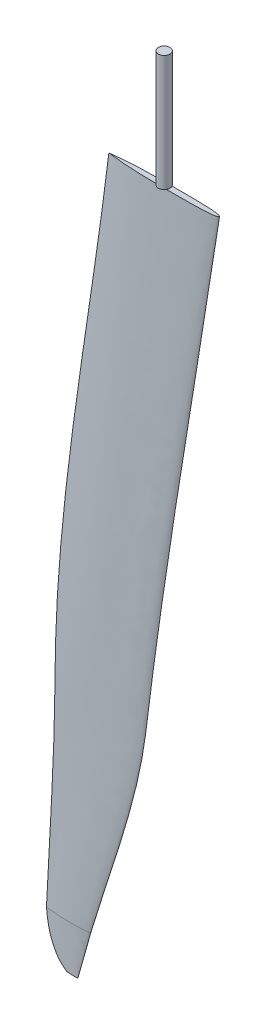
ISO-10303-21;
HEADER;
FILE_DESCRIPTION(('STEP AP214'),'2;1');
FILE_NAME('part.step','',(''),(''),'','','');
FILE_SCHEMA(('AUTOMOTIVE_DESIGN { 1 0 10303 214 1 1 1 1 }'));
ENDSEC;
DATA;
#1=APPLICATION_CONTEXT('core data for automotive mechanical design processes');
#2=APPLICATION_PROTOCOL_DEFINITION('international standard','automotive_design',2000,#1);
#3=PRODUCT_CONTEXT('',#1,'mechanical');
#4=PRODUCT('Part','Part','',(#3));
#5=PRODUCT_RELATED_PRODUCT_CATEGORY('part','',(#4));
#6=PRODUCT_DEFINITION_FORMATION('','',#4);
#7=PRODUCT_DEFINITION_CONTEXT('part definition',#1,'design');
#8=PRODUCT_DEFINITION('design','',#6,#7);
#9=PRODUCT_DEFINITION_SHAPE('','',#8);
#10=(LENGTH_UNIT() NAMED_UNIT(*) SI_UNIT(.MILLI.,.METRE.));
#11=(NAMED_UNIT(*) PLANE_ANGLE_UNIT() SI_UNIT($,.RADIAN.));
#12=(NAMED_UNIT(*) SI_UNIT($,.STERADIAN.) SOLID_ANGLE_UNIT());
#13=UNCERTAINTY_MEASURE_WITH_UNIT(LENGTH_MEASURE(1.E-05),#10,'distance_accuracy_value','');
#14=(GEOMETRIC_REPRESENTATION_CONTEXT(3) GLOBAL_UNCERTAINTY_ASSIGNED_CONTEXT((#13)) GLOBAL_UNIT_ASSIGNED_CONTEXT((#10,
#11,#12)) REPRESENTATION_CONTEXT('',''));
#15=CARTESIAN_POINT('',(0.,0.,0.));
#16=DIRECTION('',(0.,0.,1.));
#17=DIRECTION('',(1.,0.,0.));
#18=AXIS2_PLACEMENT_3D('',#15,#16,#17);
#19=CARTESIAN_POINT('',(76.702932548045,111.97,-0.497830161884721));
#20=DIRECTION('',(0.,-1.,0.));
#21=DIRECTION('',(0.,0.,-1.));
#22=AXIS2_PLACEMENT_3D('',#19,#20,#21);
#23=PLANE('',#22);
#24=CARTESIAN_POINT('',(76.6802273729442,111.97,0.));
#25=DIRECTION('',(0.,1.,0.));
#26=DIRECTION('',(0.,0.,1.));
#27=AXIS2_PLACEMENT_3D('',#24,#25,#26);
#28=CIRCLE('',#27,0.999999999999998);
#29=CARTESIAN_POINT('',(77.5470204146373,111.97,0.498673613828869));
#30=VERTEX_POINT('',#29);
#31=CARTESIAN_POINT('',(77.5470204660705,111.97,-0.498673569141511));
#32=VERTEX_POINT('',#31);
#33=EDGE_CURVE('E173',#30,#32,#28,.T.);
#34=ORIENTED_EDGE('',*,*,#33,.F.);
#35=CARTESIAN_POINT('',(67.1506283651811,111.97,0.));
#36=CARTESIAN_POINT('',(70.9159039814108,111.97,0.497453591992562));
#37=CARTESIAN_POINT('',(75.7654168237773,111.97,0.506141123952713));
#38=CARTESIAN_POINT('',(81.2977344542727,111.97,0.490883466840249));
#39=CARTESIAN_POINT('',(83.6217296160196,111.97,0.440338608276895));
#40=CARTESIAN_POINT('',(85.1332465132736,111.97,0.352786970097833));
#41=CARTESIAN_POINT('',(86.0027353789991,111.97,0.188311142382824));
#42=CARTESIAN_POINT('',(86.2098263807073,111.97,0.));
#43=B_SPLINE_CURVE_WITH_KNOTS('',3,(#35,#36,#37,#38,#39,#40,#41,#42),.UNSPECIFIED.,.F.,.F.,(4,1,
1,1,1,4),(0.,0.594113588524702,0.758066547978053,0.868843325466446,0.956435882018142,1.),.UNSPECIFIED.);
#44=CARTESIAN_POINT('',(86.2098263807073,111.97,0.));
#45=VERTEX_POINT('',#44);
#46=EDGE_CURVE('E221',#30,#45,#43,.T.);
#47=ORIENTED_EDGE('',*,*,#46,.T.);
#48=CARTESIAN_POINT('',(86.2098263807073,111.97,0.));
#49=CARTESIAN_POINT('',(86.0027353789991,111.97,-0.188311142382824));
#50=CARTESIAN_POINT('',(85.1332465132736,111.97,-0.352786970097833));
#51=CARTESIAN_POINT('',(83.6217296160196,111.97,-0.440338608276895));
#52=CARTESIAN_POINT('',(81.2977344542727,111.97,-0.490883466840249));
#53=CARTESIAN_POINT('',(75.7654168237773,111.97,-0.506141123952713));
#54=CARTESIAN_POINT('',(70.9159039814108,111.97,-0.497453591992562));
#55=CARTESIAN_POINT('',(67.1506283651811,111.97,0.));
#56=B_SPLINE_CURVE_WITH_KNOTS('',3,(#48,#49,#50,#51,#52,#53,#54,#55),.UNSPECIFIED.,.F.,.F.,(4,1,
1,1,1,4),(0.,0.0435641179818584,0.131156674533554,0.241933452021947,0.405886411475298,1.),.UNSPECIFIED.);
#57=EDGE_CURVE('E264',#45,#32,#56,.T.);
#58=ORIENTED_EDGE('',*,*,#57,.T.);
#59=EDGE_LOOP('',(#34,#47,#58));
#60=FACE_BOUND('',#59,.T.);
#61=ADVANCED_FACE('F152',(#60),#23,.F.);
#62=CARTESIAN_POINT('',(75.8105956877333,111.97,-0.493703171641632));
#63=VERTEX_POINT('',#62);
#64=CARTESIAN_POINT('',(75.810596103507,111.97,0.493701787739398));
#65=VERTEX_POINT('',#64);
#66=EDGE_CURVE('E12',#63,#65,#28,.T.);
#67=ORIENTED_EDGE('',*,*,#66,.F.);
#68=CARTESIAN_POINT('',(67.1506283651811,111.97,0.));
#69=VERTEX_POINT('',#68);
#70=EDGE_CURVE('E206',#63,#69,#56,.T.);
#71=ORIENTED_EDGE('',*,*,#70,.T.);
#72=EDGE_CURVE('E202',#69,#65,#43,.T.);
#73=ORIENTED_EDGE('',*,*,#72,.T.);
#74=EDGE_LOOP('',(#67,#71,#73));
#75=FACE_BOUND('',#74,.T.);
#76=ADVANCED_FACE('F205',(#75),#23,.F.);
#77=CARTESIAN_POINT('',(60.9746921269892,-13.75,-0.0589309155080839));
#78=DIRECTION('',(0.,-1.,0.));
#79=DIRECTION('',(0.,0.,-1.));
#80=AXIS2_PLACEMENT_3D('',#77,#78,#79);
#81=PLANE('',#80);
#82=CARTESIAN_POINT('',(61.8267361525159,-13.75,0.));
#83=CARTESIAN_POINT('',(61.8135660963527,-13.75,-0.0211945142453168));
#84=CARTESIAN_POINT('',(61.5798767337124,-13.75,-0.051653607515997));
#85=CARTESIAN_POINT('',(61.4361518701727,-13.75,-0.0560764173018039));
#86=CARTESIAN_POINT('',(61.1609037413836,-13.75,-0.0610050337445953));
#87=CARTESIAN_POINT('',(60.8861591998935,-13.75,-0.0591512789111404));
#88=CARTESIAN_POINT('',(60.6104916033573,-13.75,-0.0482739613043076));
#89=CARTESIAN_POINT('',(59.9071795781515,-13.75,0.));
#90=B_SPLINE_CURVE_WITH_KNOTS('',3,(#82,#83,#84,#85,#86,#87,#88,#89),.UNSPECIFIED.,.F.,.F.,(4,1,
1,1,1,4),(0.,0.0544288698921828,0.163386951312522,0.293350860045436,0.488289193609328,1.),.UNSPECIFIED.);
#91=CARTESIAN_POINT('',(61.8267361525159,-13.75,0.));
#92=VERTEX_POINT('',#91);
#93=CARTESIAN_POINT('',(59.9071795781515,-13.75,0.));
#94=VERTEX_POINT('',#93);
#95=EDGE_CURVE('E420',#92,#94,#90,.T.);
#96=ORIENTED_EDGE('',*,*,#95,.F.);
#97=CARTESIAN_POINT('',(59.9071795781515,-13.75,0.));
#98=CARTESIAN_POINT('',(60.6104916033573,-13.75,0.0482739613043075));
#99=CARTESIAN_POINT('',(60.8861591998935,-13.75,0.0591512789111402));
#100=CARTESIAN_POINT('',(61.1609037413835,-13.75,0.061005033744595));
#101=CARTESIAN_POINT('',(61.4361518701727,-13.75,0.0560764173018035));
#102=CARTESIAN_POINT('',(61.5798767337123,-13.75,0.0516536075159965));
#103=CARTESIAN_POINT('',(61.8135660963528,-13.75,0.0211945142453163));
#104=CARTESIAN_POINT('',(61.8267361525159,-13.75,0.));
#105=B_SPLINE_CURVE_WITH_KNOTS('',3,(#97,#98,#99,#100,#101,#102,#103,#104),.UNSPECIFIED.,.F.,
.F.,(4,1,1,1,1,4),(0.,0.511710806390672,0.706649139954564,0.836613048687478,0.945571130107817,
1.),.UNSPECIFIED.);
#106=EDGE_CURVE('E165',#94,#92,#105,.T.);
#107=ORIENTED_EDGE('',*,*,#106,.F.);
#108=EDGE_LOOP('',(#96,#107));
#109=FACE_BOUND('',#108,.T.);
#110=ADVANCED_FACE('F287',(#109),#81,.T.);
#111=CARTESIAN_POINT('',(59.9071795781515,-13.75,0.));
#112=CARTESIAN_POINT('',(58.9436996542179,-13.1275926316983,0.));
#113=CARTESIAN_POINT('',(57.0023921387807,-10.5579605143645,0.));
#114=CARTESIAN_POINT('',(56.6084604941947,-7.89425929836498,0.));
#115=CARTESIAN_POINT('',(56.4043208381168,-5.89999999999999,0.));
#116=CARTESIAN_POINT('',(60.6104916033573,-13.75,0.0482739613043075));
#117=CARTESIAN_POINT('',(59.7014989149766,-13.1024767660526,0.05140102690981));
#118=CARTESIAN_POINT('',(57.2536268218596,-10.5910555596202,-0.0117815925349381));
#119=CARTESIAN_POINT('',(57.2654735359656,-7.8691434327193,0.0750603270478986));
#120=CARTESIAN_POINT('',(57.1975771151871,-5.89999999999999,0.0923221822741686));
#121=CARTESIAN_POINT('',(60.8861591998935,-13.75,0.0591512789111402));
#122=CARTESIAN_POINT('',(60.0524108832577,-13.067792908225,0.0665966786090887));
#123=CARTESIAN_POINT('',(58.786308239496,-10.6367582983052,0.124391686046844));
#124=CARTESIAN_POINT('',(58.7095448371081,-7.83445957489166,0.165742665258711));
#125=CARTESIAN_POINT('',(58.8297940717402,-5.89999999999999,0.20684235036335));
#126=CARTESIAN_POINT('',(61.1609037413835,-13.75,0.061005033744595));
#127=CARTESIAN_POINT('',(60.7754199921905,-13.0122672969034,0.0883818883884002));
#128=CARTESIAN_POINT('',(60.2370883575813,-10.7099241069404,0.15049513291759));
#129=CARTESIAN_POINT('',(60.4543665058024,-7.77893396357006,0.218559206247804));
#130=CARTESIAN_POINT('',(60.6835760568635,-5.89999999999999,0.255916640523267));
#131=CARTESIAN_POINT('',(61.4361518701727,-13.75,0.0560764173018035));
#132=CARTESIAN_POINT('',(61.167567871449,-12.9679631029457,0.0944587804461957));
#133=CARTESIAN_POINT('',(61.0481791736743,-10.768303512402,0.176161234901139));
#134=CARTESIAN_POINT('',(61.8877178149971,-7.73462976961239,0.206154142741435));
#135=CARTESIAN_POINT('',(62.5155313482736,-5.89999999999999,0.22473485696504));
#136=CARTESIAN_POINT('',(61.5798767337123,-13.75,0.0516536075159965));
#137=CARTESIAN_POINT('',(61.7422631731391,-12.9924332065512,0.0838599669211522));
#138=CARTESIAN_POINT('',(62.2818000312581,-10.736059384421,0.118133294053892));
#139=CARTESIAN_POINT('',(63.1953377857043,-7.75909987321784,0.159306633699801));
#140=CARTESIAN_POINT('',(63.7597286219158,-5.89999999999999,0.162009132111184));
#141=CARTESIAN_POINT('',(61.8135660963528,-13.75,0.0211945142453163));
#142=CARTESIAN_POINT('',(62.0156149962029,-12.9985247139195,0.0292423949551231));
#143=CARTESIAN_POINT('',(62.6737021163026,-10.728032636911,0.0660388243131483));
#144=CARTESIAN_POINT('',(63.4844298077934,-7.7651913805862,0.0407527597086066));
#145=CARTESIAN_POINT('',(64.0166395393438,-5.89999999999999,0.0414280730701588));
#146=CARTESIAN_POINT('',(61.8267361525159,-13.75,0.));
#147=CARTESIAN_POINT('',(62.0419977531395,-13.0005539693732,0.));
#148=CARTESIAN_POINT('',(62.687525219156,-10.7253586975764,0.));
#149=CARTESIAN_POINT('',(63.5154995234077,-7.76722063603981,0.));
#150=CARTESIAN_POINT('',(64.0369888079181,-5.89999999999999,0.));
#151=B_SPLINE_SURFACE_WITH_KNOTS('',3,3,((#111,#112,#113,#114,#115),(#116,#117,#118,#119,#120),
(#121,#122,#123,#124,#125),(#126,#127,#128,#129,#130),(#131,#132,#133,#134,#135),(#136,#137,
#138,#139,#140),(#141,#142,#143,#144,#145),(#146,#147,#148,#149,#150)),.UNSPECIFIED.,.F.,.F.,
.F.,(4,1,1,1,1,4),(4,1,4),(0.,0.511710806390672,0.706649139954564,0.836613048687478,
0.945571130107817,1.),(0.,0.314882734139741,1.),.UNSPECIFIED.);
#152=CARTESIAN_POINT('',(61.8267361525159,-13.75,0.));
#153=CARTESIAN_POINT('',(62.0419977531395,-13.0005539693732,0.));
#154=CARTESIAN_POINT('',(62.687525219156,-10.7253586975764,0.));
#155=CARTESIAN_POINT('',(63.5154995234077,-7.76722063603981,0.));
#156=CARTESIAN_POINT('',(64.0369888079181,-5.89999999999999,0.));
#157=B_SPLINE_CURVE_WITH_KNOTS('',3,(#152,#153,#154,#155,#156),.UNSPECIFIED.,.F.,.F.,(4,1,4),
(0.,0.314882734139741,1.),.UNSPECIFIED.);
#158=CARTESIAN_POINT('',(64.0369888079181,-5.89999999999999,0.));
#159=VERTEX_POINT('',#158);
#160=EDGE_CURVE('E394',#92,#159,#157,.T.);
#161=CARTESIAN_POINT('',(56.4043208381168,-5.89999999999999,0.));
#162=CARTESIAN_POINT('',(57.1975771151871,-5.89999999999999,0.0923221822741686));
#163=CARTESIAN_POINT('',(58.8297940717402,-5.89999999999999,0.20684235036335));
#164=CARTESIAN_POINT('',(60.6835760568635,-5.89999999999999,0.255916640523267));
#165=CARTESIAN_POINT('',(62.5155313482736,-5.89999999999999,0.22473485696504));
#166=CARTESIAN_POINT('',(63.7597286219158,-5.89999999999999,0.162009132111184));
#167=CARTESIAN_POINT('',(64.0166395393438,-5.89999999999999,0.0414280730701588));
#168=CARTESIAN_POINT('',(64.0369888079181,-5.89999999999999,0.));
#169=B_SPLINE_CURVE_WITH_KNOTS('',3,(#161,#162,#163,#164,#165,#166,#167,#168),.UNSPECIFIED.,.F.,
.F.,(4,1,1,1,1,4),(0.,0.511710806390672,0.706649139954564,0.836613048687478,0.945571130107817,
1.),.UNSPECIFIED.);
#170=CARTESIAN_POINT('',(56.4043208381168,-5.89999999999999,0.));
#171=VERTEX_POINT('',#170);
#172=EDGE_CURVE('E387',#171,#159,#169,.T.);
#173=CARTESIAN_POINT('',(59.9071795781515,-13.75,0.));
#174=CARTESIAN_POINT('',(58.9436996542179,-13.1275926316983,0.));
#175=CARTESIAN_POINT('',(57.0023921387807,-10.5579605143645,0.));
#176=CARTESIAN_POINT('',(56.6084604941947,-7.89425929836498,0.));
#177=CARTESIAN_POINT('',(56.4043208381168,-5.89999999999999,0.));
#178=B_SPLINE_CURVE_WITH_KNOTS('',3,(#173,#174,#175,#176,#177),.UNSPECIFIED.,.F.,.F.,(4,1,4),
(0.,0.314882734139741,1.),.UNSPECIFIED.);
#179=EDGE_CURVE('E392',#171,#94,#178,.F.);
#180=ORIENTED_EDGE('',*,*,#106,.T.);
#181=ORIENTED_EDGE('',*,*,#160,.T.);
#182=ORIENTED_EDGE('',*,*,#172,.F.);
#183=ORIENTED_EDGE('',*,*,#179,.T.);
#184=EDGE_LOOP('',(#180,#181,#182,#183));
#185=FACE_BOUND('',#184,.T.);
#186=ADVANCED_FACE('F446',(#185),#151,.T.);
#187=CARTESIAN_POINT('',(61.8267361525159,-13.75,0.));
#188=CARTESIAN_POINT('',(62.0419977531395,-13.0005539693732,0.));
#189=CARTESIAN_POINT('',(62.687525219156,-10.7253586975764,0.));
#190=CARTESIAN_POINT('',(63.5154995234077,-7.76722063603981,0.));
#191=CARTESIAN_POINT('',(64.0369888079181,-5.89999999999999,0.));
#192=CARTESIAN_POINT('',(61.8135660963527,-13.75,-0.0211945142453168));
#193=CARTESIAN_POINT('',(62.0156149962028,-12.9985247139195,-0.0292423949551239));
#194=CARTESIAN_POINT('',(62.6737021163027,-10.728032636911,-0.0660388243131497));
#195=CARTESIAN_POINT('',(63.4844298077933,-7.7651913805862,-0.0407527597086082));
#196=CARTESIAN_POINT('',(64.0166395393437,-5.89999999999999,-0.0414280730701606));
#197=CARTESIAN_POINT('',(61.5798767337124,-13.75,-0.051653607515997));
#198=CARTESIAN_POINT('',(61.7422631731392,-12.9924332065512,-0.0838599669211529));
#199=CARTESIAN_POINT('',(62.281800031258,-10.736059384421,-0.118133294053893));
#200=CARTESIAN_POINT('',(63.1953377857044,-7.75909987321783,-0.159306633699803));
#201=CARTESIAN_POINT('',(63.759728621916,-5.89999999999999,-0.162009132111186));
#202=CARTESIAN_POINT('',(61.4361518701727,-13.75,-0.0560764173018039));
#203=CARTESIAN_POINT('',(61.167567871449,-12.9679631029457,-0.0944587804461963));
#204=CARTESIAN_POINT('',(61.0481791736742,-10.7683035124021,-0.17616123490114));
#205=CARTESIAN_POINT('',(61.8877178149969,-7.73462976961239,-0.206154142741437));
#206=CARTESIAN_POINT('',(62.5155313482736,-5.89999999999999,-0.224734856965042));
#207=CARTESIAN_POINT('',(61.1609037413836,-13.75,-0.0610050337445953));
#208=CARTESIAN_POINT('',(60.7754199921903,-13.0122672969034,-0.0883818883884006));
#209=CARTESIAN_POINT('',(60.2370883575816,-10.7099241069404,-0.150495132917591));
#210=CARTESIAN_POINT('',(60.4543665058025,-7.77893396357006,-0.218559206247805));
#211=CARTESIAN_POINT('',(60.6835760568635,-5.89999999999999,-0.255916640523268));
#212=CARTESIAN_POINT('',(60.8861591998935,-13.75,-0.0591512789111404));
#213=CARTESIAN_POINT('',(60.0524108832579,-13.067792908225,-0.0665966786090891));
#214=CARTESIAN_POINT('',(58.786308239496,-10.6367582983052,-0.124391686046844));
#215=CARTESIAN_POINT('',(58.709544837108,-7.83445957489165,-0.165742665258712));
#216=CARTESIAN_POINT('',(58.8297940717402,-5.89999999999999,-0.206842350363351));
#217=CARTESIAN_POINT('',(60.6104916033573,-13.75,-0.0482739613043076));
#218=CARTESIAN_POINT('',(59.7014989149768,-13.1024767660527,-0.0514010269098103));
#219=CARTESIAN_POINT('',(57.2536268218594,-10.5910555596202,0.0117815925349382));
#220=CARTESIAN_POINT('',(57.2654735359656,-7.8691434327193,-0.075060327047899));
#221=CARTESIAN_POINT('',(57.1975771151871,-5.89999999999999,-0.0923221822741689));
#222=CARTESIAN_POINT('',(59.9071795781515,-13.75,0.));
#223=CARTESIAN_POINT('',(58.9436996542179,-13.1275926316983,0.));
#224=CARTESIAN_POINT('',(57.0023921387807,-10.5579605143645,0.));
#225=CARTESIAN_POINT('',(56.6084604941947,-7.89425929836498,0.));
#226=CARTESIAN_POINT('',(56.4043208381168,-5.89999999999999,0.));
#227=B_SPLINE_SURFACE_WITH_KNOTS('',3,3,((#187,#188,#189,#190,#191),(#192,#193,#194,#195,#196),
(#197,#198,#199,#200,#201),(#202,#203,#204,#205,#206),(#207,#208,#209,#210,#211),(#212,#213,
#214,#215,#216),(#217,#218,#219,#220,#221),(#222,#223,#224,#225,#226)),.UNSPECIFIED.,.F.,.F.,
.F.,(4,1,1,1,1,4),(4,1,4),(0.,0.0544288698921828,0.163386951312522,0.293350860045436,
0.488289193609328,1.),(0.,0.314882734139741,1.),.UNSPECIFIED.);
#228=CARTESIAN_POINT('',(64.0369888079181,-5.89999999999999,0.));
#229=CARTESIAN_POINT('',(64.0166395393437,-5.89999999999999,-0.0414280730701606));
#230=CARTESIAN_POINT('',(63.759728621916,-5.89999999999999,-0.162009132111186));
#231=CARTESIAN_POINT('',(62.5155313482736,-5.89999999999999,-0.224734856965042));
#232=CARTESIAN_POINT('',(60.6835760568635,-5.89999999999999,-0.255916640523268));
#233=CARTESIAN_POINT('',(58.8297940717402,-5.89999999999999,-0.206842350363351));
#234=CARTESIAN_POINT('',(57.1975771151871,-5.89999999999999,-0.0923221822741689));
#235=CARTESIAN_POINT('',(56.4043208381168,-5.89999999999999,0.));
#236=B_SPLINE_CURVE_WITH_KNOTS('',3,(#228,#229,#230,#231,#232,#233,#234,#235),.UNSPECIFIED.,.F.,
.F.,(4,1,1,1,1,4),(0.,0.0544288698921828,0.163386951312522,0.293350860045436,0.488289193609328,
1.),.UNSPECIFIED.);
#237=EDGE_CURVE('E368',#159,#171,#236,.T.);
#238=ORIENTED_EDGE('',*,*,#95,.T.);
#239=ORIENTED_EDGE('',*,*,#179,.F.);
#240=ORIENTED_EDGE('',*,*,#237,.F.);
#241=ORIENTED_EDGE('',*,*,#160,.F.);
#242=EDGE_LOOP('',(#238,#239,#240,#241));
#243=FACE_BOUND('',#242,.T.);
#244=ADVANCED_FACE('F154',(#243),#227,.T.);
#245=CARTESIAN_POINT('',(56.4043208381168,-5.89999999999999,0.));
#246=CARTESIAN_POINT('',(56.929863755655,5.02157487239858,0.));
#247=CARTESIAN_POINT('',(57.8178730133569,17.3153764186441,0.));
#248=CARTESIAN_POINT('',(57.9969880837557,56.8132656422555,0.));
#249=CARTESIAN_POINT('',(63.9202838172542,85.1192966659957,0.));
#250=CARTESIAN_POINT('',(67.1506283651811,111.97,0.));
#251=CARTESIAN_POINT('',(57.1975771151871,-5.89999999999999,0.0923221822741686));
#252=CARTESIAN_POINT('',(58.1939928309719,5.02400368304435,0.107290685861241));
#253=CARTESIAN_POINT('',(58.0829325147574,17.3151953566585,-0.0974461682064128));
#254=CARTESIAN_POINT('',(65.2979109367299,56.8136680182268,0.862398215432405));
#255=CARTESIAN_POINT('',(67.0722497458938,85.1105886837411,0.428523183034948));
#256=CARTESIAN_POINT('',(70.3936651498614,111.97,0.428457425679411));
#257=CARTESIAN_POINT('',(58.5698596504365,-5.89999999999999,0.188604741998632));
#258=CARTESIAN_POINT('',(60.1129746432567,5.02682361451852,0.220952185545341));
#259=CARTESIAN_POINT('',(61.9149092757858,17.3149851375568,0.143685278392551));
#260=CARTESIAN_POINT('',(67.3325589393936,56.8141351903664,0.965516046014904));
#261=CARTESIAN_POINT('',(70.7622750250627,85.1004784212228,0.503459962000777));
#262=CARTESIAN_POINT('',(74.1894267793607,111.97,0.503317858126889));
#263=CARTESIAN_POINT('',(60.1462414654928,-5.89999999999998,0.241692037057756));
#264=CARTESIAN_POINT('',(62.5348533356131,5.00482034816025,0.295602121725787));
#265=CARTESIAN_POINT('',(65.7946361898815,17.3161065642996,0.336726827688475));
#266=CARTESIAN_POINT('',(70.9912913827546,56.812047137547,0.64339562187997));
#267=CARTESIAN_POINT('',(75.0106710593067,85.1034885172638,0.489804318569968));
#268=CARTESIAN_POINT('',(78.6958153609018,111.97,0.497573036081584));
#269=CARTESIAN_POINT('',(60.8174986428875,-5.89999999999998,0.247987197575005));
#270=CARTESIAN_POINT('',(63.4489565461504,4.99761718577178,0.302018589110387));
#271=CARTESIAN_POINT('',(67.1540210613339,17.3164707666315,0.359583036077389));
#272=CARTESIAN_POINT('',(72.2569108280448,56.8113723297185,0.5738102253354));
#273=CARTESIAN_POINT('',(76.4952527795778,85.1040473845657,0.480570328430034));
#274=CARTESIAN_POINT('',(80.2649708641404,111.97,0.493731740165991));
#275=CARTESIAN_POINT('',(61.6752299147661,-5.89999999999998,0.238734860902057));
#276=CARTESIAN_POINT('',(64.4680609808557,4.99086856212552,0.285161190450771));
#277=CARTESIAN_POINT('',(68.5130685754775,17.3168218214595,0.309638609171365));
#278=CARTESIAN_POINT('',(73.2716889921541,56.8107105889612,0.643254031179548));
#279=CARTESIAN_POINT('',(77.871415247697,85.1060091890675,0.471625573191366));
#280=CARTESIAN_POINT('',(81.7307120804467,111.97,0.478237773001723));
#281=CARTESIAN_POINT('',(62.2636852459227,-5.89999999999999,0.225182827105867));
#282=CARTESIAN_POINT('',(65.1188686886513,4.98879412918726,0.268975662195901));
#283=CARTESIAN_POINT('',(69.2748829716852,17.3169280705813,0.28415455034129));
#284=CARTESIAN_POINT('',(74.0238300516413,56.8105121616898,0.646047456891553));
#285=CARTESIAN_POINT('',(78.7237245623873,85.1063694286568,0.456119361470166));
#286=CARTESIAN_POINT('',(82.6331263809469,111.97,0.461415155853586));
#287=CARTESIAN_POINT('',(62.7337633900951,-5.89999999999999,0.208931558680401));
#288=CARTESIAN_POINT('',(65.6099993105165,4.99008332580127,0.256168771387465));
#289=CARTESIAN_POINT('',(69.7412372684397,17.3168539636117,0.295879668496886));
#290=CARTESIAN_POINT('',(74.8524464217919,56.8106597165381,0.5472586986303));
#291=CARTESIAN_POINT('',(79.4019784729534,85.1049644706103,0.42903631895491));
#292=CARTESIAN_POINT('',(83.3385815780975,111.97,0.439817169684901));
#293=CARTESIAN_POINT('',(63.2439263881186,-5.89999999999999,0.186597249899759));
#294=CARTESIAN_POINT('',(66.1374572529107,4.99203991376256,0.236124388472266));
#295=CARTESIAN_POINT('',(70.2202829760617,17.3167436935444,0.286793906801251));
#296=CARTESIAN_POINT('',(75.7902429618213,56.8108770532766,0.493112162596065));
#297=CARTESIAN_POINT('',(80.1434265831269,85.1031540066672,0.399618854637543));
#298=CARTESIAN_POINT('',(84.1116617406324,111.97,0.410575999019365));
#299=CARTESIAN_POINT('',(63.6485736971616,-5.89999999999999,0.152042622266769));
#300=CARTESIAN_POINT('',(66.5768256506221,4.99272479881647,0.198371365165214));
#301=CARTESIAN_POINT('',(70.6787088129796,17.3167016796659,0.241660527086041));
#302=CARTESIAN_POINT('',(76.5181893243363,56.8109633784914,0.485892008356335));
#303=CARTESIAN_POINT('',(80.790190576021,85.1020208825248,0.366935294476771));
#304=CARTESIAN_POINT('',(84.7931936770374,111.97,0.372483860641367));
#305=CARTESIAN_POINT('',(63.9481389802248,-5.89999999999999,0.0735787891478025));
#306=CARTESIAN_POINT('',(67.0584450944246,4.98257133390649,0.119053108746076));
#307=CARTESIAN_POINT('',(71.5855078329015,17.3172343099025,0.183819712065556));
#308=CARTESIAN_POINT('',(76.7595330236985,56.8099543890168,0.244782278362292));
#309=CARTESIAN_POINT('',(81.5554958558011,85.1056246724779,0.239317630143119));
#310=CARTESIAN_POINT('',(85.6419051237827,111.97,0.256567168688363));
#311=CARTESIAN_POINT('',(64.0207015335585,-5.89999999999999,0.0331584592251225));
#312=CARTESIAN_POINT('',(67.2101296752774,4.9785112110559,0.053374687621692));
#313=CARTESIAN_POINT('',(71.9845117713456,17.3174451493547,0.13234263751018));
#314=CARTESIAN_POINT('',(76.7709503269489,56.8095573603378,0.0988732283517906));
#315=CARTESIAN_POINT('',(81.8811412799984,85.1067518562062,0.180642624985604));
#316=CARTESIAN_POINT('',(86.0027353789991,111.97,0.188311142382824));
#317=CARTESIAN_POINT('',(64.0369888079181,-5.89999999999999,0.));
#318=CARTESIAN_POINT('',(67.2897451309611,4.97526154463375,0.));
#319=CARTESIAN_POINT('',(72.1367922639307,17.317613902349,0.));
#320=CARTESIAN_POINT('',(76.925911395138,56.8092395840502,0.));
#321=CARTESIAN_POINT('',(82.0600708274504,85.107654038541,0.));
#322=CARTESIAN_POINT('',(86.2098263807073,111.97,0.));
#323=B_SPLINE_SURFACE_WITH_KNOTS('',3,3,((#245,#246,#247,#248,#249,#250),(#251,#252,#253,#254,
#255,#256),(#257,#258,#259,#260,#261,#262),(#263,#264,#265,#266,#267,#268),(#269,#270,#271,#272,
#273,#274),(#275,#276,#277,#278,#279,#280),(#281,#282,#283,#284,#285,#286),(#287,#288,#289,#290,
#291,#292),(#293,#294,#295,#296,#297,#298),(#299,#300,#301,#302,#303,#304),(#305,#306,#307,#308,
#309,#310),(#311,#312,#313,#314,#315,#316),(#317,#318,#319,#320,#321,#322)),.UNSPECIFIED.,.F.,
.F.,.F.,(4,1,1,1,1,1,1,1,1,1,4),(4,1,1,4),(0.,0.511710806390672,0.594113588524702,
0.706649139954564,0.758066547978053,0.823616657814187,0.847508856829512,0.868843325466446,
0.945571130107817,0.956435882018142,1.),(0.,0.279819395029661,0.317830754840469,1.),.UNSPECIFIED.);
#324=CARTESIAN_POINT('',(64.0369888079181,-5.89999999999999,0.));
#325=CARTESIAN_POINT('',(67.2897451309611,4.97526154463375,0.));
#326=CARTESIAN_POINT('',(72.1367922639307,17.317613902349,0.));
#327=CARTESIAN_POINT('',(76.925911395138,56.8092395840502,0.));
#328=CARTESIAN_POINT('',(82.0600708274504,85.107654038541,0.));
#329=CARTESIAN_POINT('',(86.2098263807073,111.97,0.));
#330=B_SPLINE_CURVE_WITH_KNOTS('',3,(#324,#325,#326,#327,#328,#329),.UNSPECIFIED.,.F.,.F.,(4,1,
1,4),(0.,0.279819395029661,0.317830754840469,1.),.UNSPECIFIED.);
#331=EDGE_CURVE('E359',#159,#45,#330,.T.);
#332=EDGE_CURVE('E159',#65,#30,#43,.T.);
#333=CARTESIAN_POINT('',(56.4043208381168,-5.89999999999999,0.));
#334=CARTESIAN_POINT('',(56.929863755655,5.02157487239858,0.));
#335=CARTESIAN_POINT('',(57.8178730133569,17.3153764186441,0.));
#336=CARTESIAN_POINT('',(57.9969880837557,56.8132656422555,0.));
#337=CARTESIAN_POINT('',(63.9202838172542,85.1192966659957,0.));
#338=CARTESIAN_POINT('',(67.1506283651811,111.97,0.));
#339=B_SPLINE_CURVE_WITH_KNOTS('',3,(#333,#334,#335,#336,#337,#338),.UNSPECIFIED.,.F.,.F.,(4,1,
1,4),(0.,0.279819395029661,0.317830754840469,1.),.UNSPECIFIED.);
#340=EDGE_CURVE('E212',#69,#171,#339,.F.);
#341=ORIENTED_EDGE('',*,*,#172,.T.);
#342=ORIENTED_EDGE('',*,*,#331,.T.);
#343=ORIENTED_EDGE('',*,*,#46,.F.);
#344=ORIENTED_EDGE('',*,*,#332,.F.);
#345=ORIENTED_EDGE('',*,*,#72,.F.);
#346=ORIENTED_EDGE('',*,*,#340,.T.);
#347=EDGE_LOOP('',(#341,#342,#343,#344,#345,#346));
#348=FACE_BOUND('',#347,.T.);
#349=ADVANCED_FACE('F219',(#348),#323,.T.);
#350=CARTESIAN_POINT('',(64.0369888079181,-5.89999999999999,0.));
#351=CARTESIAN_POINT('',(67.2897451309611,4.97526154463375,0.));
#352=CARTESIAN_POINT('',(72.1367922639307,17.317613902349,0.));
#353=CARTESIAN_POINT('',(76.925911395138,56.8092395840502,0.));
#354=CARTESIAN_POINT('',(82.0600708274504,85.107654038541,0.));
#355=CARTESIAN_POINT('',(86.2098263807073,111.97,0.));
#356=CARTESIAN_POINT('',(64.0207015335585,-5.89999999999999,-0.0331584592251243));
#357=CARTESIAN_POINT('',(67.2101296752774,4.97851121105589,-0.0533746876216945));
#358=CARTESIAN_POINT('',(71.9845117713457,17.3174451493547,-0.132342637510183));
#359=CARTESIAN_POINT('',(76.7709503269487,56.8095573603378,-0.0988732283517949));
#360=CARTESIAN_POINT('',(81.8811412799982,85.1067518562062,-0.180642624985605));
#361=CARTESIAN_POINT('',(86.0027353789991,111.97,-0.188311142382824));
#362=CARTESIAN_POINT('',(63.9481389802247,-5.89999999999999,-0.0735787891478043));
#363=CARTESIAN_POINT('',(67.058445094425,4.98257133390647,-0.119053108746078));
#364=CARTESIAN_POINT('',(71.5855078329016,17.3172343099025,-0.18381971206556));
#365=CARTESIAN_POINT('',(76.759533023698,56.8099543890168,-0.244782278362295));
#366=CARTESIAN_POINT('',(81.5554958558007,85.1056246724779,-0.239317630143121));
#367=CARTESIAN_POINT('',(85.6419051237827,111.97,-0.256567168688363));
#368=CARTESIAN_POINT('',(63.6485736971616,-5.89999999999999,-0.152042622266771));
#369=CARTESIAN_POINT('',(66.5768256506215,4.99272479881648,-0.198371365165217));
#370=CARTESIAN_POINT('',(70.6787088129795,17.3167016796659,-0.241660527086045));
#371=CARTESIAN_POINT('',(76.5181893243367,56.8109633784914,-0.485892008356338));
#372=CARTESIAN_POINT('',(80.7901905760218,85.1020208825248,-0.366935294476772));
#373=CARTESIAN_POINT('',(84.7931936770374,111.97,-0.372483860641367));
#374=CARTESIAN_POINT('',(63.2439263881186,-5.89999999999999,-0.18659724989976));
#375=CARTESIAN_POINT('',(66.1374572529108,4.99203991376257,-0.236124388472269));
#376=CARTESIAN_POINT('',(70.2202829760616,17.3167436935444,-0.286793906801254));
#377=CARTESIAN_POINT('',(75.7902429618215,56.8108770532765,-0.493112162596069));
#378=CARTESIAN_POINT('',(80.1434265831267,85.1031540066673,-0.399618854637544));
#379=CARTESIAN_POINT('',(84.1116617406324,111.97,-0.410575999019365));
#380=CARTESIAN_POINT('',(62.7337633900951,-5.89999999999999,-0.208931558680402));
#381=CARTESIAN_POINT('',(65.6099993105165,4.99008332580126,-0.256168771387467));
#382=CARTESIAN_POINT('',(69.7412372684397,17.3168539636117,-0.295879668496889));
#383=CARTESIAN_POINT('',(74.8524464217919,56.8106597165381,-0.547258698630305));
#384=CARTESIAN_POINT('',(79.4019784729535,85.1049644706103,-0.429036318954911));
#385=CARTESIAN_POINT('',(83.3385815780976,111.97,-0.4398171696849));
#386=CARTESIAN_POINT('',(62.2636852459227,-5.89999999999999,-0.225182827105868));
#387=CARTESIAN_POINT('',(65.1188686886512,4.98879412918725,-0.268975662195903));
#388=CARTESIAN_POINT('',(69.2748829716852,17.3169280705813,-0.284154550341293));
#389=CARTESIAN_POINT('',(74.0238300516415,56.8105121616898,-0.646047456891559));
#390=CARTESIAN_POINT('',(78.7237245623872,85.1063694286569,-0.456119361470168));
#391=CARTESIAN_POINT('',(82.6331263809469,111.97,-0.461415155853586));
#392=CARTESIAN_POINT('',(61.6752299147661,-5.89999999999999,-0.238734860902058));
#393=CARTESIAN_POINT('',(64.4680609808558,4.99086856212551,-0.285161190450773));
#394=CARTESIAN_POINT('',(68.5130685754775,17.3168218214595,-0.309638609171368));
#395=CARTESIAN_POINT('',(73.2716889921541,56.8107105889612,-0.643254031179552));
#396=CARTESIAN_POINT('',(77.8714152476973,85.1060091890675,-0.471625573191367));
#397=CARTESIAN_POINT('',(81.7307120804467,111.97,-0.478237773001723));
#398=CARTESIAN_POINT('',(60.8174986428875,-5.89999999999999,-0.247987197575006));
#399=CARTESIAN_POINT('',(63.4489565461505,4.99761718577178,-0.302018589110389));
#400=CARTESIAN_POINT('',(67.1540210613339,17.3164707666315,-0.359583036077392));
#401=CARTESIAN_POINT('',(72.2569108280446,56.8113723297186,-0.573810225335402));
#402=CARTESIAN_POINT('',(76.4952527795776,85.1040473845656,-0.480570328430034));
#403=CARTESIAN_POINT('',(80.2649708641404,111.97,-0.493731740165992));
#404=CARTESIAN_POINT('',(60.1462414654928,-5.89999999999999,-0.241692037057757));
#405=CARTESIAN_POINT('',(62.5348533356135,5.00482034816027,-0.295602121725788));
#406=CARTESIAN_POINT('',(65.7946361898815,17.3161065642996,-0.336726827688478));
#407=CARTESIAN_POINT('',(70.9912913827546,56.812047137547,-0.643395621879972));
#408=CARTESIAN_POINT('',(75.0106710593067,85.1034885172638,-0.489804318569969));
#409=CARTESIAN_POINT('',(78.6958153609018,111.97,-0.497573036081584));
#410=CARTESIAN_POINT('',(58.5698596504364,-5.89999999999999,-0.188604741998632));
#411=CARTESIAN_POINT('',(60.1129746432556,5.02682361451843,-0.220952185545341));
#412=CARTESIAN_POINT('',(61.9149092757856,17.3149851375568,-0.143685278392551));
#413=CARTESIAN_POINT('',(67.332558939394,56.8141351903663,-0.965516046014907));
#414=CARTESIAN_POINT('',(70.762275025063,85.100478421223,-0.503459962000778));
#415=CARTESIAN_POINT('',(74.1894267793606,111.97,-0.503317858126889));
#416=CARTESIAN_POINT('',(57.1975771151871,-5.89999999999999,-0.0923221822741689));
#417=CARTESIAN_POINT('',(58.1939928309716,5.02400368304433,-0.107290685861242));
#418=CARTESIAN_POINT('',(58.0829325147576,17.3151953566585,0.0974461682064124));
#419=CARTESIAN_POINT('',(65.2979109367295,56.8136680182268,-0.862398215432406));
#420=CARTESIAN_POINT('',(67.0722497458941,85.1105886837411,-0.428523183034949));
#421=CARTESIAN_POINT('',(70.3936651498614,111.97,-0.428457425679411));
#422=CARTESIAN_POINT('',(56.4043208381168,-5.89999999999999,0.));
#423=CARTESIAN_POINT('',(56.929863755655,5.02157487239858,0.));
#424=CARTESIAN_POINT('',(57.8178730133569,17.3153764186441,0.));
#425=CARTESIAN_POINT('',(57.9969880837557,56.8132656422555,0.));
#426=CARTESIAN_POINT('',(63.9202838172542,85.1192966659957,0.));
#427=CARTESIAN_POINT('',(67.1506283651811,111.97,0.));
#428=B_SPLINE_SURFACE_WITH_KNOTS('',3,3,((#350,#351,#352,#353,#354,#355),(#356,#357,#358,#359,
#360,#361),(#362,#363,#364,#365,#366,#367),(#368,#369,#370,#371,#372,#373),(#374,#375,#376,#377,
#378,#379),(#380,#381,#382,#383,#384,#385),(#386,#387,#388,#389,#390,#391),(#392,#393,#394,#395,
#396,#397),(#398,#399,#400,#401,#402,#403),(#404,#405,#406,#407,#408,#409),(#410,#411,#412,#413,
#414,#415),(#416,#417,#418,#419,#420,#421),(#422,#423,#424,#425,#426,#427)),.UNSPECIFIED.,.F.,
.F.,.F.,(4,1,1,1,1,1,1,1,1,1,4),(4,1,1,4),(0.,0.0435641179818584,0.0544288698921828,
0.131156674533554,0.152491143170488,0.176383342185813,0.241933452021947,0.293350860045436,
0.405886411475298,0.488289193609328,1.),(0.,0.279819395029661,0.317830754840469,1.),.UNSPECIFIED.);
#429=EDGE_CURVE('E265',#32,#63,#56,.T.);
#430=ORIENTED_EDGE('',*,*,#237,.T.);
#431=ORIENTED_EDGE('',*,*,#340,.F.);
#432=ORIENTED_EDGE('',*,*,#70,.F.);
#433=ORIENTED_EDGE('',*,*,#429,.F.);
#434=ORIENTED_EDGE('',*,*,#57,.F.);
#435=ORIENTED_EDGE('',*,*,#331,.F.);
#436=EDGE_LOOP('',(#430,#431,#432,#433,#434,#435));
#437=FACE_BOUND('',#436,.T.);
#438=ADVANCED_FACE('F291',(#437),#428,.T.);
#439=CARTESIAN_POINT('',(76.6802273729442,111.97,0.));
#440=DIRECTION('',(0.,1.,0.));
#441=DIRECTION('',(0.,0.,1.));
#442=AXIS2_PLACEMENT_3D('',#439,#440,#441);
#443=PLANE('',#442);
#444=EDGE_CURVE('E232',#32,#63,#28,.T.);
#445=ORIENTED_EDGE('',*,*,#444,.F.);
#446=ORIENTED_EDGE('',*,*,#429,.T.);
#447=EDGE_LOOP('',(#445,#446));
#448=FACE_BOUND('',#447,.T.);
#449=ADVANCED_FACE('F279',(#448),#443,.F.);
#450=EDGE_CURVE('E229',#65,#30,#28,.T.);
#451=ORIENTED_EDGE('',*,*,#450,.F.);
#452=ORIENTED_EDGE('',*,*,#332,.T.);
#453=EDGE_LOOP('',(#451,#452));
#454=FACE_BOUND('',#453,.T.);
#455=ADVANCED_FACE('F230',(#454),#443,.F.);
#456=CARTESIAN_POINT('',(76.6802273729442,131.97,0.));
#457=DIRECTION('',(0.,-1.,0.));
#458=DIRECTION('',(0.,0.,-1.));
#459=AXIS2_PLACEMENT_3D('',#456,#457,#458);
#460=CYLINDRICAL_SURFACE('',#459,0.999999999999998);
#461=CARTESIAN_POINT('',(76.6802273729442,131.97,0.));
#462=DIRECTION('',(0.,1.,0.));
#463=DIRECTION('',(0.,0.,1.));
#464=AXIS2_PLACEMENT_3D('',#461,#462,#463);
#465=CIRCLE('',#464,0.999999999999998);
#466=CARTESIAN_POINT('',(76.6802273729442,131.97,0.999999999999998));
#467=VERTEX_POINT('',#466);
#468=EDGE_CURVE('E240',#467,#467,#465,.T.);
#469=ORIENTED_EDGE('',*,*,#468,.F.);
#470=EDGE_LOOP('',(#469));
#471=FACE_BOUND('',#470,.T.);
#472=ORIENTED_EDGE('',*,*,#33,.T.);
#473=ORIENTED_EDGE('',*,*,#444,.T.);
#474=ORIENTED_EDGE('',*,*,#66,.T.);
#475=ORIENTED_EDGE('',*,*,#450,.T.);
#476=EDGE_LOOP('',(#472,#473,#474,#475));
#477=FACE_BOUND('',#476,.T.);
#478=ADVANCED_FACE('F235',(#471,#477),#460,.T.);
#479=CARTESIAN_POINT('',(76.6802273729442,131.97,0.));
#480=DIRECTION('',(0.,1.,0.));
#481=DIRECTION('',(0.,0.,1.));
#482=AXIS2_PLACEMENT_3D('',#479,#480,#481);
#483=PLANE('',#482);
#484=ORIENTED_EDGE('',*,*,#468,.T.);
#485=EDGE_LOOP('',(#484));
#486=FACE_BOUND('',#485,.T.);
#487=ADVANCED_FACE('F270',(#486),#483,.T.);
#488=CLOSED_SHELL('',(#61,#76,#110,#186,#244,#349,#438,#449,#455,#478,#487));
#489=MANIFOLD_SOLID_BREP('B2',#488);
#490=ADVANCED_BREP_SHAPE_REPRESENTATION('',(#18,#489),#14);
#491=SHAPE_DEFINITION_REPRESENTATION(#9,#490);
ENDSEC;
END-ISO-10303-21;
